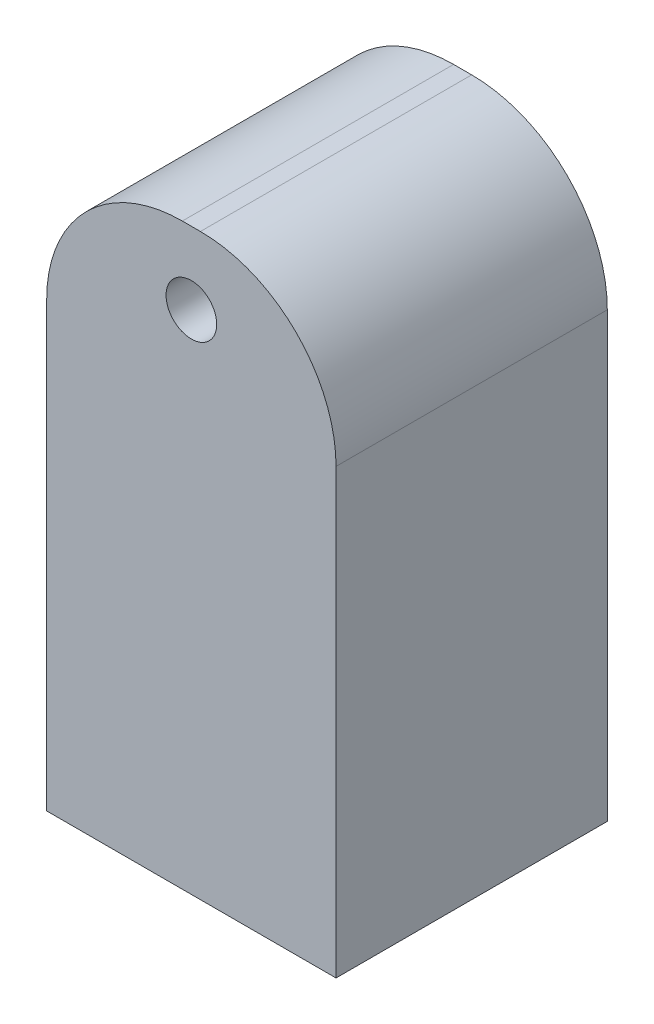
ISO-10303-21;
HEADER;
FILE_DESCRIPTION(('STEP AP214'),'2;1');
FILE_NAME('part.step','',(''),(''),'','','');
FILE_SCHEMA(('AUTOMOTIVE_DESIGN { 1 0 10303 214 1 1 1 1 }'));
ENDSEC;
DATA;
#1=APPLICATION_CONTEXT('core data for automotive mechanical design processes');
#2=APPLICATION_PROTOCOL_DEFINITION('international standard','automotive_design',2000,#1);
#3=PRODUCT_CONTEXT('',#1,'mechanical');
#4=PRODUCT('Part','Part','',(#3));
#5=PRODUCT_RELATED_PRODUCT_CATEGORY('part','',(#4));
#6=PRODUCT_DEFINITION_FORMATION('','',#4);
#7=PRODUCT_DEFINITION_CONTEXT('part definition',#1,'design');
#8=PRODUCT_DEFINITION('design','',#6,#7);
#9=PRODUCT_DEFINITION_SHAPE('','',#8);
#10=(LENGTH_UNIT() NAMED_UNIT(*) SI_UNIT(.MILLI.,.METRE.));
#11=(NAMED_UNIT(*) PLANE_ANGLE_UNIT() SI_UNIT($,.RADIAN.));
#12=(NAMED_UNIT(*) SI_UNIT($,.STERADIAN.) SOLID_ANGLE_UNIT());
#13=UNCERTAINTY_MEASURE_WITH_UNIT(LENGTH_MEASURE(1.E-05),#10,'distance_accuracy_value','');
#14=(GEOMETRIC_REPRESENTATION_CONTEXT(3) GLOBAL_UNCERTAINTY_ASSIGNED_CONTEXT((#13)) GLOBAL_UNIT_ASSIGNED_CONTEXT((#10,
#11,#12)) REPRESENTATION_CONTEXT('',''));
#15=CARTESIAN_POINT('',(0.,0.,0.));
#16=DIRECTION('',(0.,0.,1.));
#17=DIRECTION('',(1.,0.,0.));
#18=AXIS2_PLACEMENT_3D('',#15,#16,#17);
#19=CARTESIAN_POINT('',(-3.,121.337894443762,-28.4999989718199));
#20=DIRECTION('',(0.,1.,0.));
#21=DIRECTION('',(1.,0.,0.));
#22=AXIS2_PLACEMENT_3D('',#19,#20,#21);
#23=PLANE('',#22);
#24=DIRECTION('',(-1.,0.,0.));
#25=VECTOR('',#24,1.);
#26=CARTESIAN_POINT('',(5.43145750507619,121.337894443762,-35.9999989718199));
#27=LINE('',#26,#25);
#28=CARTESIAN_POINT('',(5.,121.337894443762,-35.9999989718199));
#29=VERTEX_POINT('',#28);
#30=CARTESIAN_POINT('',(-11.,121.337894443762,-35.9999989718199));
#31=VERTEX_POINT('',#30);
#32=EDGE_CURVE('E134',#29,#31,#27,.T.);
#33=ORIENTED_EDGE('',*,*,#32,.F.);
#34=DIRECTION('',(0.,0.,-1.));
#35=VECTOR('',#34,1.);
#36=CARTESIAN_POINT('',(5.,121.337894443762,-20.9999989718199));
#37=LINE('',#36,#35);
#38=CARTESIAN_POINT('',(5.,121.337894443762,-20.9999989718199));
#39=VERTEX_POINT('',#38);
#40=EDGE_CURVE('E151',#39,#29,#37,.T.);
#41=ORIENTED_EDGE('',*,*,#40,.F.);
#42=DIRECTION('',(1.,0.,0.));
#43=VECTOR('',#42,1.);
#44=CARTESIAN_POINT('',(-11.,121.337894443762,-20.9999989718199));
#45=LINE('',#44,#43);
#46=CARTESIAN_POINT('',(-11.,121.337894443762,-20.9999989718199));
#47=VERTEX_POINT('',#46);
#48=EDGE_CURVE('E158',#47,#39,#45,.T.);
#49=ORIENTED_EDGE('',*,*,#48,.F.);
#50=DIRECTION('',(0.,0.,1.));
#51=VECTOR('',#50,1.);
#52=CARTESIAN_POINT('',(-11.,121.337894443762,-50.9999989718199));
#53=LINE('',#52,#51);
#54=EDGE_CURVE('E11',#31,#47,#53,.T.);
#55=ORIENTED_EDGE('',*,*,#54,.F.);
#56=EDGE_LOOP('',(#33,#41,#49,#55));
#57=FACE_BOUND('',#56,.T.);
#58=ADVANCED_FACE('F17',(#57),#23,.F.);
#59=CARTESIAN_POINT('',(-11.,121.337894443762,-35.9999989718199));
#60=DIRECTION('',(-1.,0.,0.));
#61=DIRECTION('',(0.,0.,1.));
#62=AXIS2_PLACEMENT_3D('',#59,#60,#61);
#63=PLANE('',#62);
#64=DIRECTION('',(0.,0.,1.));
#65=VECTOR('',#64,1.);
#66=CARTESIAN_POINT('',(-11.,145.837894443762,-32.2499989718199));
#67=LINE('',#66,#65);
#68=CARTESIAN_POINT('',(-11.,145.837894443762,-35.9999989718199));
#69=VERTEX_POINT('',#68);
#70=CARTESIAN_POINT('',(-11.,145.837894443762,-20.9999989718199));
#71=VERTEX_POINT('',#70);
#72=EDGE_CURVE('E130',#69,#71,#67,.T.);
#73=ORIENTED_EDGE('',*,*,#72,.F.);
#74=DIRECTION('',(0.,1.,0.));
#75=VECTOR('',#74,1.);
#76=CARTESIAN_POINT('',(-11.,121.337894443762,-35.9999989718199));
#77=LINE('',#76,#75);
#78=EDGE_CURVE('E164',#31,#69,#77,.T.);
#79=ORIENTED_EDGE('',*,*,#78,.F.);
#80=ORIENTED_EDGE('',*,*,#54,.T.);
#81=DIRECTION('',(0.,1.,0.));
#82=VECTOR('',#81,1.);
#83=CARTESIAN_POINT('',(-11.,121.337894443762,-20.9999989718199));
#84=LINE('',#83,#82);
#85=EDGE_CURVE('E57',#47,#71,#84,.T.);
#86=ORIENTED_EDGE('',*,*,#85,.T.);
#87=EDGE_LOOP('',(#73,#79,#80,#86));
#88=FACE_BOUND('',#87,.T.);
#89=ADVANCED_FACE('F268',(#88),#63,.T.);
#90=CARTESIAN_POINT('',(-3.,149.337894443762,-20.9999989718199));
#91=DIRECTION('',(0.,0.,-1.));
#92=DIRECTION('',(-1.,0.,0.));
#93=AXIS2_PLACEMENT_3D('',#90,#91,#92);
#94=CYLINDRICAL_SURFACE('',#93,1.4);
#95=CARTESIAN_POINT('',(-3.,149.337894443762,-20.9999989718199));
#96=DIRECTION('',(0.,0.,-1.));
#97=DIRECTION('',(-1.,0.,0.));
#98=AXIS2_PLACEMENT_3D('',#95,#96,#97);
#99=CIRCLE('',#98,1.4);
#100=CARTESIAN_POINT('',(-1.6,149.337894443762,-20.9999989718199));
#101=VERTEX_POINT('',#100);
#102=EDGE_CURVE('E112',#101,#101,#99,.T.);
#103=ORIENTED_EDGE('',*,*,#102,.F.);
#104=DIRECTION('',(0.,0.,-1.));
#105=VECTOR('',#104,1.);
#106=CARTESIAN_POINT('',(-1.6,149.337894443762,-20.9999989718199));
#107=LINE('',#106,#105);
#108=CARTESIAN_POINT('',(-1.6,149.337894443762,-35.9999989718199));
#109=VERTEX_POINT('',#108);
#110=EDGE_CURVE('E28',#101,#109,#107,.T.);
#111=ORIENTED_EDGE('',*,*,#110,.T.);
#112=CARTESIAN_POINT('',(-3.,149.337894443762,-35.9999989718199));
#113=DIRECTION('',(0.,0.,1.));
#114=DIRECTION('',(-1.,0.,0.));
#115=AXIS2_PLACEMENT_3D('',#112,#113,#114);
#116=CIRCLE('',#115,1.4);
#117=EDGE_CURVE('E162',#109,#109,#116,.T.);
#118=ORIENTED_EDGE('',*,*,#117,.F.);
#119=ORIENTED_EDGE('',*,*,#110,.F.);
#120=EDGE_LOOP('',(#103,#111,#118,#119));
#121=FACE_BOUND('',#120,.T.);
#122=ADVANCED_FACE('F251',(#121),#94,.F.);
#123=CARTESIAN_POINT('',(5.,121.337894443762,-20.9999989718199));
#124=DIRECTION('',(1.,0.,0.));
#125=DIRECTION('',(0.,1.,0.));
#126=AXIS2_PLACEMENT_3D('',#123,#124,#125);
#127=PLANE('',#126);
#128=DIRECTION('',(0.,0.,-1.));
#129=VECTOR('',#128,1.);
#130=CARTESIAN_POINT('',(5.,145.837894443762,-24.7499989718199));
#131=LINE('',#130,#129);
#132=CARTESIAN_POINT('',(5.,145.837894443762,-20.9999989718199));
#133=VERTEX_POINT('',#132);
#134=CARTESIAN_POINT('',(5.,145.837894443762,-35.9999989718199));
#135=VERTEX_POINT('',#134);
#136=EDGE_CURVE('E108',#133,#135,#131,.T.);
#137=ORIENTED_EDGE('',*,*,#136,.F.);
#138=DIRECTION('',(0.,1.,0.));
#139=VECTOR('',#138,1.);
#140=CARTESIAN_POINT('',(5.,121.337894443762,-20.9999989718199));
#141=LINE('',#140,#139);
#142=EDGE_CURVE('E154',#39,#133,#141,.T.);
#143=ORIENTED_EDGE('',*,*,#142,.F.);
#144=ORIENTED_EDGE('',*,*,#40,.T.);
#145=DIRECTION('',(0.,1.,0.));
#146=VECTOR('',#145,1.);
#147=CARTESIAN_POINT('',(5.,121.337894443762,-35.9999989718199));
#148=LINE('',#147,#146);
#149=EDGE_CURVE('E138',#29,#135,#148,.T.);
#150=ORIENTED_EDGE('',*,*,#149,.T.);
#151=EDGE_LOOP('',(#137,#143,#144,#150));
#152=FACE_BOUND('',#151,.T.);
#153=ADVANCED_FACE('F174',(#152),#127,.T.);
#154=CARTESIAN_POINT('',(5.,121.337894443762,-35.9999989718199));
#155=DIRECTION('',(0.,0.,-1.));
#156=DIRECTION('',(0.,-1.,0.));
#157=AXIS2_PLACEMENT_3D('',#154,#155,#156);
#158=PLANE('',#157);
#159=ORIENTED_EDGE('',*,*,#117,.T.);
#160=EDGE_LOOP('',(#159));
#161=FACE_BOUND('',#160,.T.);
#162=CARTESIAN_POINT('',(-3.5,145.837894443762,-35.9999989718199));
#163=DIRECTION('',(0.,0.,1.));
#164=DIRECTION('',(-0.707106781186548,0.707106781186548,0.));
#165=AXIS2_PLACEMENT_3D('',#162,#163,#164);
#166=CIRCLE('',#165,7.5);
#167=CARTESIAN_POINT('',(-3.5,153.337894443762,-35.9999989718199));
#168=VERTEX_POINT('',#167);
#169=EDGE_CURVE('E21',#168,#69,#166,.T.);
#170=ORIENTED_EDGE('',*,*,#169,.F.);
#171=DIRECTION('',(-1.,0.,0.));
#172=VECTOR('',#171,1.);
#173=CARTESIAN_POINT('',(5.43145750507619,153.337894443762,-35.9999989718199));
#174=LINE('',#173,#172);
#175=CARTESIAN_POINT('',(-2.5,153.337894443762,-35.9999989718199));
#176=VERTEX_POINT('',#175);
#177=EDGE_CURVE('E115',#176,#168,#174,.T.);
#178=ORIENTED_EDGE('',*,*,#177,.F.);
#179=CARTESIAN_POINT('',(-2.5,145.837894443762,-35.9999989718199));
#180=DIRECTION('',(0.,0.,1.));
#181=DIRECTION('',(0.707106781186548,0.707106781186548,0.));
#182=AXIS2_PLACEMENT_3D('',#179,#180,#181);
#183=CIRCLE('',#182,7.5);
#184=EDGE_CURVE('E102',#135,#176,#183,.T.);
#185=ORIENTED_EDGE('',*,*,#184,.F.);
#186=ORIENTED_EDGE('',*,*,#149,.F.);
#187=ORIENTED_EDGE('',*,*,#32,.T.);
#188=ORIENTED_EDGE('',*,*,#78,.T.);
#189=EDGE_LOOP('',(#170,#178,#185,#186,#187,#188));
#190=FACE_BOUND('',#189,.T.);
#191=ADVANCED_FACE('F116',(#161,#190),#158,.T.);
#192=CARTESIAN_POINT('',(-2.5,145.837894443762,-24.7499989718199));
#193=DIRECTION('',(0.,0.,-1.));
#194=DIRECTION('',(0.707106781186548,0.707106781186548,0.));
#195=AXIS2_PLACEMENT_3D('',#192,#193,#194);
#196=CYLINDRICAL_SURFACE('',#195,7.5);
#197=ORIENTED_EDGE('',*,*,#184,.T.);
#198=DIRECTION('',(0.,0.,1.));
#199=VECTOR('',#198,1.);
#200=CARTESIAN_POINT('',(-2.5,153.337894443762,-24.7499989718199));
#201=LINE('',#200,#199);
#202=CARTESIAN_POINT('',(-2.5,153.337894443762,-20.9999989718199));
#203=VERTEX_POINT('',#202);
#204=EDGE_CURVE('E107',#176,#203,#201,.T.);
#205=ORIENTED_EDGE('',*,*,#204,.T.);
#206=CARTESIAN_POINT('',(-2.5,145.837894443762,-20.9999989718199));
#207=DIRECTION('',(0.,0.,-1.));
#208=DIRECTION('',(0.707106781186548,0.707106781186548,0.));
#209=AXIS2_PLACEMENT_3D('',#206,#207,#208);
#210=CIRCLE('',#209,7.5);
#211=EDGE_CURVE('E145',#203,#133,#210,.T.);
#212=ORIENTED_EDGE('',*,*,#211,.T.);
#213=ORIENTED_EDGE('',*,*,#136,.T.);
#214=EDGE_LOOP('',(#197,#205,#212,#213));
#215=FACE_BOUND('',#214,.T.);
#216=ADVANCED_FACE('F104',(#215),#196,.T.);
#217=CARTESIAN_POINT('',(-11.,121.337894443762,-20.9999989718199));
#218=DIRECTION('',(0.,0.,1.));
#219=DIRECTION('',(1.,0.,0.));
#220=AXIS2_PLACEMENT_3D('',#217,#218,#219);
#221=PLANE('',#220);
#222=ORIENTED_EDGE('',*,*,#102,.T.);
#223=EDGE_LOOP('',(#222));
#224=FACE_BOUND('',#223,.T.);
#225=CARTESIAN_POINT('',(-3.5,145.837894443762,-20.9999989718199));
#226=DIRECTION('',(0.,0.,-1.));
#227=DIRECTION('',(-0.707106781186548,0.707106781186548,0.));
#228=AXIS2_PLACEMENT_3D('',#225,#226,#227);
#229=CIRCLE('',#228,7.5);
#230=CARTESIAN_POINT('',(-3.5,153.337894443762,-20.9999989718199));
#231=VERTEX_POINT('',#230);
#232=EDGE_CURVE('E149',#71,#231,#229,.T.);
#233=ORIENTED_EDGE('',*,*,#232,.F.);
#234=ORIENTED_EDGE('',*,*,#85,.F.);
#235=ORIENTED_EDGE('',*,*,#48,.T.);
#236=ORIENTED_EDGE('',*,*,#142,.T.);
#237=ORIENTED_EDGE('',*,*,#211,.F.);
#238=DIRECTION('',(1.,0.,0.));
#239=VECTOR('',#238,1.);
#240=CARTESIAN_POINT('',(-11.,153.337894443762,-20.9999989718199));
#241=LINE('',#240,#239);
#242=EDGE_CURVE('E68',#231,#203,#241,.T.);
#243=ORIENTED_EDGE('',*,*,#242,.F.);
#244=EDGE_LOOP('',(#233,#234,#235,#236,#237,#243));
#245=FACE_BOUND('',#244,.T.);
#246=ADVANCED_FACE('F19',(#224,#245),#221,.T.);
#247=CARTESIAN_POINT('',(-3.,153.337894443762,-28.4999989718199));
#248=DIRECTION('',(0.,1.,0.));
#249=DIRECTION('',(1.,0.,0.));
#250=AXIS2_PLACEMENT_3D('',#247,#248,#249);
#251=PLANE('',#250);
#252=DIRECTION('',(0.,0.,-1.));
#253=VECTOR('',#252,1.);
#254=CARTESIAN_POINT('',(-3.5,153.337894443762,-32.2499989718199));
#255=LINE('',#254,#253);
#256=EDGE_CURVE('E146',#231,#168,#255,.T.);
#257=ORIENTED_EDGE('',*,*,#256,.F.);
#258=ORIENTED_EDGE('',*,*,#242,.T.);
#259=ORIENTED_EDGE('',*,*,#204,.F.);
#260=ORIENTED_EDGE('',*,*,#177,.T.);
#261=EDGE_LOOP('',(#257,#258,#259,#260));
#262=FACE_BOUND('',#261,.T.);
#263=ADVANCED_FACE('F123',(#262),#251,.T.);
#264=CARTESIAN_POINT('',(-3.5,145.837894443762,-32.2499989718199));
#265=DIRECTION('',(0.,0.,1.));
#266=DIRECTION('',(-0.707106781186548,0.707106781186548,0.));
#267=AXIS2_PLACEMENT_3D('',#264,#265,#266);
#268=CYLINDRICAL_SURFACE('',#267,7.5);
#269=ORIENTED_EDGE('',*,*,#232,.T.);
#270=ORIENTED_EDGE('',*,*,#256,.T.);
#271=ORIENTED_EDGE('',*,*,#169,.T.);
#272=ORIENTED_EDGE('',*,*,#72,.T.);
#273=EDGE_LOOP('',(#269,#270,#271,#272));
#274=FACE_BOUND('',#273,.T.);
#275=ADVANCED_FACE('F193',(#274),#268,.T.);
#276=CLOSED_SHELL('',(#58,#89,#122,#153,#191,#216,#246,#263,#275));
#277=MANIFOLD_SOLID_BREP('B1',#276);
#278=ADVANCED_BREP_SHAPE_REPRESENTATION('',(#18,#277),#14);
#279=SHAPE_DEFINITION_REPRESENTATION(#9,#278);
ENDSEC;
END-ISO-10303-21;
